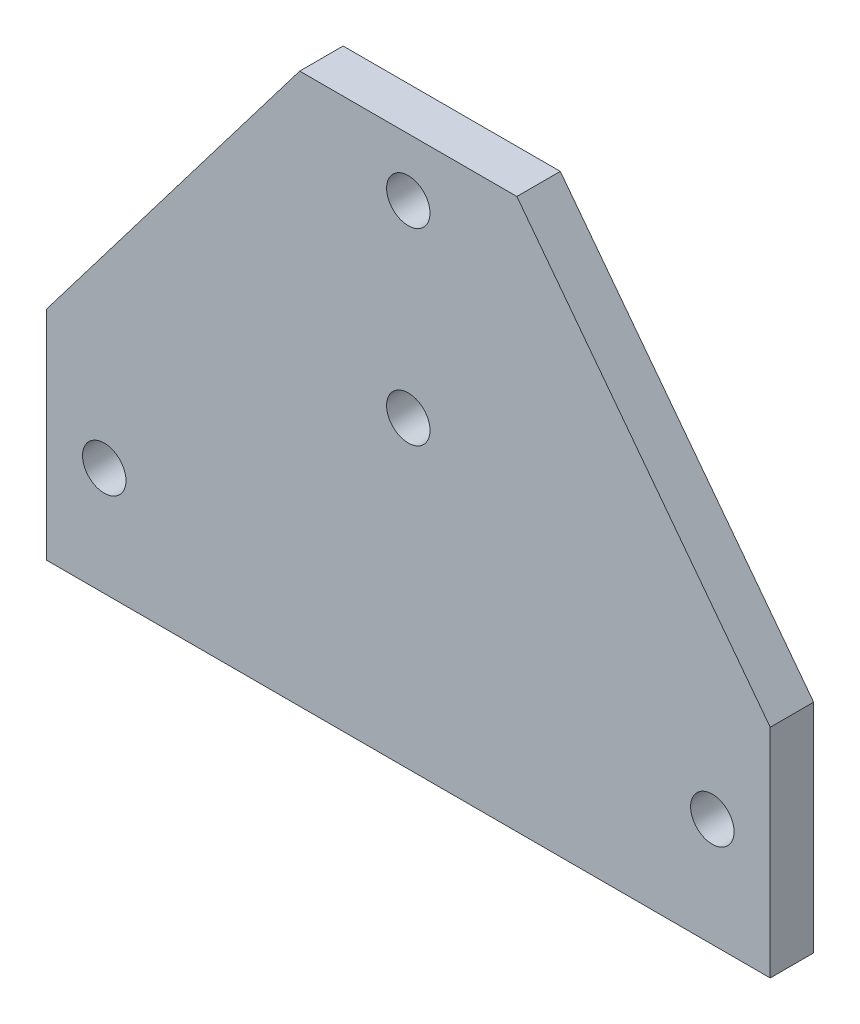
ISO-10303-21;
HEADER;
FILE_DESCRIPTION(('STEP AP214'),'2;1');
FILE_NAME('part.step','',(''),(''),'','','');
FILE_SCHEMA(('AUTOMOTIVE_DESIGN { 1 0 10303 214 1 1 1 1 }'));
ENDSEC;
DATA;
#1=APPLICATION_CONTEXT('core data for automotive mechanical design processes');
#2=APPLICATION_PROTOCOL_DEFINITION('international standard','automotive_design',2000,#1);
#3=PRODUCT_CONTEXT('',#1,'mechanical');
#4=PRODUCT('Part','Part','',(#3));
#5=PRODUCT_RELATED_PRODUCT_CATEGORY('part','',(#4));
#6=PRODUCT_DEFINITION_FORMATION('','',#4);
#7=PRODUCT_DEFINITION_CONTEXT('part definition',#1,'design');
#8=PRODUCT_DEFINITION('design','',#6,#7);
#9=PRODUCT_DEFINITION_SHAPE('','',#8);
#10=(LENGTH_UNIT() NAMED_UNIT(*) SI_UNIT(.MILLI.,.METRE.));
#11=(NAMED_UNIT(*) PLANE_ANGLE_UNIT() SI_UNIT($,.RADIAN.));
#12=(NAMED_UNIT(*) SI_UNIT($,.STERADIAN.) SOLID_ANGLE_UNIT());
#13=UNCERTAINTY_MEASURE_WITH_UNIT(LENGTH_MEASURE(1.E-05),#10,'distance_accuracy_value','');
#14=(GEOMETRIC_REPRESENTATION_CONTEXT(3) GLOBAL_UNCERTAINTY_ASSIGNED_CONTEXT((#13)) GLOBAL_UNIT_ASSIGNED_CONTEXT((#10,
#11,#12)) REPRESENTATION_CONTEXT('',''));
#15=CARTESIAN_POINT('',(0.,0.,0.));
#16=DIRECTION('',(0.,0.,1.));
#17=DIRECTION('',(1.,0.,0.));
#18=AXIS2_PLACEMENT_3D('',#15,#16,#17);
#19=CARTESIAN_POINT('',(-17.5,-23.,3.));
#20=DIRECTION('',(0.795828694120859,-0.605521832483262,0.));
#21=DIRECTION('',(0.605521832483262,0.795828694120859,0.));
#22=AXIS2_PLACEMENT_3D('',#19,#20,#21);
#23=PLANE('',#22);
#24=DIRECTION('',(-0.605521832483262,-0.795828694120859,0.));
#25=VECTOR('',#24,1.);
#26=CARTESIAN_POINT('',(-17.5,-23.,0.));
#27=LINE('',#26,#25);
#28=CARTESIAN_POINT('',(0.,0.,0.));
#29=VERTEX_POINT('',#28);
#30=CARTESIAN_POINT('',(-17.5,-23.,0.));
#31=VERTEX_POINT('',#30);
#32=EDGE_CURVE('E123',#29,#31,#27,.T.);
#33=ORIENTED_EDGE('',*,*,#32,.T.);
#34=DIRECTION('',(0.,0.,-1.));
#35=VECTOR('',#34,1.);
#36=CARTESIAN_POINT('',(-17.5,-23.,3.));
#37=LINE('',#36,#35);
#38=CARTESIAN_POINT('',(-17.5,-23.,3.));
#39=VERTEX_POINT('',#38);
#40=EDGE_CURVE('E11',#39,#31,#37,.T.);
#41=ORIENTED_EDGE('',*,*,#40,.F.);
#42=DIRECTION('',(-0.605521832483262,-0.795828694120859,0.));
#43=VECTOR('',#42,1.);
#44=CARTESIAN_POINT('',(-17.5,-23.,3.));
#45=LINE('',#44,#43);
#46=CARTESIAN_POINT('',(0.,0.,3.));
#47=VERTEX_POINT('',#46);
#48=EDGE_CURVE('E134',#47,#39,#45,.T.);
#49=ORIENTED_EDGE('',*,*,#48,.F.);
#50=DIRECTION('',(0.,0.,-1.));
#51=VECTOR('',#50,1.);
#52=CARTESIAN_POINT('',(0.,0.,3.));
#53=LINE('',#52,#51);
#54=EDGE_CURVE('E119',#47,#29,#53,.T.);
#55=ORIENTED_EDGE('',*,*,#54,.T.);
#56=EDGE_LOOP('',(#33,#41,#49,#55));
#57=FACE_BOUND('',#56,.T.);
#58=ADVANCED_FACE('F39',(#57),#23,.F.);
#59=CARTESIAN_POINT('',(-17.5,-38.,3.));
#60=DIRECTION('',(1.,0.,0.));
#61=DIRECTION('',(0.,0.,-1.));
#62=AXIS2_PLACEMENT_3D('',#59,#60,#61);
#63=PLANE('',#62);
#64=DIRECTION('',(0.,-1.,0.));
#65=VECTOR('',#64,1.);
#66=CARTESIAN_POINT('',(-17.5,-38.,0.));
#67=LINE('',#66,#65);
#68=CARTESIAN_POINT('',(-17.5,-38.,0.));
#69=VERTEX_POINT('',#68);
#70=EDGE_CURVE('E126',#31,#69,#67,.T.);
#71=ORIENTED_EDGE('',*,*,#70,.T.);
#72=DIRECTION('',(0.,0.,-1.));
#73=VECTOR('',#72,1.);
#74=CARTESIAN_POINT('',(-17.5,-38.,3.));
#75=LINE('',#74,#73);
#76=CARTESIAN_POINT('',(-17.5,-38.,3.));
#77=VERTEX_POINT('',#76);
#78=EDGE_CURVE('E47',#77,#69,#75,.T.);
#79=ORIENTED_EDGE('',*,*,#78,.F.);
#80=DIRECTION('',(0.,-1.,0.));
#81=VECTOR('',#80,1.);
#82=CARTESIAN_POINT('',(-17.5,-38.,3.));
#83=LINE('',#82,#81);
#84=EDGE_CURVE('E92',#39,#77,#83,.T.);
#85=ORIENTED_EDGE('',*,*,#84,.F.);
#86=ORIENTED_EDGE('',*,*,#40,.T.);
#87=EDGE_LOOP('',(#71,#79,#85,#86));
#88=FACE_BOUND('',#87,.T.);
#89=ADVANCED_FACE('F159',(#88),#63,.F.);
#90=CARTESIAN_POINT('',(32.5,-38.,3.));
#91=DIRECTION('',(0.,1.,0.));
#92=DIRECTION('',(0.,0.,1.));
#93=AXIS2_PLACEMENT_3D('',#90,#91,#92);
#94=PLANE('',#93);
#95=DIRECTION('',(1.,0.,0.));
#96=VECTOR('',#95,1.);
#97=CARTESIAN_POINT('',(32.5,-38.,0.));
#98=LINE('',#97,#96);
#99=CARTESIAN_POINT('',(32.5,-38.,0.));
#100=VERTEX_POINT('',#99);
#101=EDGE_CURVE('E129',#69,#100,#98,.T.);
#102=ORIENTED_EDGE('',*,*,#101,.T.);
#103=DIRECTION('',(0.,0.,-1.));
#104=VECTOR('',#103,1.);
#105=CARTESIAN_POINT('',(32.5,-38.,3.));
#106=LINE('',#105,#104);
#107=CARTESIAN_POINT('',(32.5,-38.,3.));
#108=VERTEX_POINT('',#107);
#109=EDGE_CURVE('E114',#108,#100,#106,.T.);
#110=ORIENTED_EDGE('',*,*,#109,.F.);
#111=DIRECTION('',(1.,0.,0.));
#112=VECTOR('',#111,1.);
#113=CARTESIAN_POINT('',(32.5,-38.,3.));
#114=LINE('',#113,#112);
#115=EDGE_CURVE('E105',#77,#108,#114,.T.);
#116=ORIENTED_EDGE('',*,*,#115,.F.);
#117=ORIENTED_EDGE('',*,*,#78,.T.);
#118=EDGE_LOOP('',(#102,#110,#116,#117));
#119=FACE_BOUND('',#118,.T.);
#120=ADVANCED_FACE('F140',(#119),#94,.F.);
#121=CARTESIAN_POINT('',(32.5,-23.,3.));
#122=DIRECTION('',(-1.,0.,0.));
#123=DIRECTION('',(0.,0.,1.));
#124=AXIS2_PLACEMENT_3D('',#121,#122,#123);
#125=PLANE('',#124);
#126=DIRECTION('',(0.,1.,0.));
#127=VECTOR('',#126,1.);
#128=CARTESIAN_POINT('',(32.5,-23.,0.));
#129=LINE('',#128,#127);
#130=CARTESIAN_POINT('',(32.5,-23.,0.));
#131=VERTEX_POINT('',#130);
#132=EDGE_CURVE('E113',#100,#131,#129,.T.);
#133=ORIENTED_EDGE('',*,*,#132,.T.);
#134=DIRECTION('',(0.,0.,-1.));
#135=VECTOR('',#134,1.);
#136=CARTESIAN_POINT('',(32.5,-23.,3.));
#137=LINE('',#136,#135);
#138=CARTESIAN_POINT('',(32.5,-23.,3.));
#139=VERTEX_POINT('',#138);
#140=EDGE_CURVE('E110',#139,#131,#137,.T.);
#141=ORIENTED_EDGE('',*,*,#140,.F.);
#142=DIRECTION('',(0.,1.,0.));
#143=VECTOR('',#142,1.);
#144=CARTESIAN_POINT('',(32.5,-23.,3.));
#145=LINE('',#144,#143);
#146=EDGE_CURVE('E99',#108,#139,#145,.T.);
#147=ORIENTED_EDGE('',*,*,#146,.F.);
#148=ORIENTED_EDGE('',*,*,#109,.T.);
#149=EDGE_LOOP('',(#133,#141,#147,#148));
#150=FACE_BOUND('',#149,.T.);
#151=ADVANCED_FACE('F111',(#150),#125,.F.);
#152=CARTESIAN_POINT('',(15.,0.,3.));
#153=DIRECTION('',(-0.795828694120859,-0.605521832483262,0.));
#154=DIRECTION('',(0.605521832483262,-0.795828694120859,0.));
#155=AXIS2_PLACEMENT_3D('',#152,#153,#154);
#156=PLANE('',#155);
#157=DIRECTION('',(-0.605521832483262,0.795828694120859,0.));
#158=VECTOR('',#157,1.);
#159=CARTESIAN_POINT('',(15.,0.,0.));
#160=LINE('',#159,#158);
#161=CARTESIAN_POINT('',(15.,0.,0.));
#162=VERTEX_POINT('',#161);
#163=EDGE_CURVE('E78',#131,#162,#160,.T.);
#164=ORIENTED_EDGE('',*,*,#163,.T.);
#165=DIRECTION('',(0.,0.,-1.));
#166=VECTOR('',#165,1.);
#167=CARTESIAN_POINT('',(15.,0.,3.));
#168=LINE('',#167,#166);
#169=CARTESIAN_POINT('',(15.,0.,3.));
#170=VERTEX_POINT('',#169);
#171=EDGE_CURVE('E115',#170,#162,#168,.T.);
#172=ORIENTED_EDGE('',*,*,#171,.F.);
#173=DIRECTION('',(-0.605521832483262,0.795828694120859,0.));
#174=VECTOR('',#173,1.);
#175=CARTESIAN_POINT('',(15.,0.,3.));
#176=LINE('',#175,#174);
#177=EDGE_CURVE('E103',#139,#170,#176,.T.);
#178=ORIENTED_EDGE('',*,*,#177,.F.);
#179=ORIENTED_EDGE('',*,*,#140,.T.);
#180=EDGE_LOOP('',(#164,#172,#178,#179));
#181=FACE_BOUND('',#180,.T.);
#182=ADVANCED_FACE('F117',(#181),#156,.F.);
#183=CARTESIAN_POINT('',(0.,0.,3.));
#184=DIRECTION('',(0.,-1.,0.));
#185=DIRECTION('',(0.,0.,-1.));
#186=AXIS2_PLACEMENT_3D('',#183,#184,#185);
#187=PLANE('',#186);
#188=DIRECTION('',(-1.,0.,0.));
#189=VECTOR('',#188,1.);
#190=CARTESIAN_POINT('',(0.,0.,0.));
#191=LINE('',#190,#189);
#192=EDGE_CURVE('E84',#162,#29,#191,.T.);
#193=ORIENTED_EDGE('',*,*,#192,.T.);
#194=ORIENTED_EDGE('',*,*,#54,.F.);
#195=DIRECTION('',(-1.,0.,0.));
#196=VECTOR('',#195,1.);
#197=CARTESIAN_POINT('',(0.,0.,3.));
#198=LINE('',#197,#196);
#199=EDGE_CURVE('E55',#170,#47,#198,.T.);
#200=ORIENTED_EDGE('',*,*,#199,.F.);
#201=ORIENTED_EDGE('',*,*,#171,.T.);
#202=EDGE_LOOP('',(#193,#194,#200,#201));
#203=FACE_BOUND('',#202,.T.);
#204=ADVANCED_FACE('F147',(#203),#187,.F.);
#205=CARTESIAN_POINT('',(0.,0.,3.));
#206=DIRECTION('',(0.,0.,-1.));
#207=DIRECTION('',(-1.,0.,0.));
#208=AXIS2_PLACEMENT_3D('',#205,#206,#207);
#209=PLANE('',#208);
#210=CARTESIAN_POINT('',(7.50000000000001,-4.,3.));
#211=DIRECTION('',(0.,0.,1.));
#212=DIRECTION('',(1.,0.,0.));
#213=AXIS2_PLACEMENT_3D('',#210,#211,#212);
#214=CIRCLE('',#213,1.5);
#215=CARTESIAN_POINT('',(9.00000000000001,-4.,3.));
#216=VERTEX_POINT('',#215);
#217=EDGE_CURVE('E244',#216,#216,#214,.T.);
#218=ORIENTED_EDGE('',*,*,#217,.F.);
#219=EDGE_LOOP('',(#218));
#220=FACE_BOUND('',#219,.T.);
#221=CARTESIAN_POINT('',(7.50000000000001,-17.,3.));
#222=DIRECTION('',(0.,0.,1.));
#223=DIRECTION('',(1.,0.,0.));
#224=AXIS2_PLACEMENT_3D('',#221,#222,#223);
#225=CIRCLE('',#224,1.5);
#226=CARTESIAN_POINT('',(9.00000000000001,-17.,3.));
#227=VERTEX_POINT('',#226);
#228=EDGE_CURVE('E249',#227,#227,#225,.T.);
#229=ORIENTED_EDGE('',*,*,#228,.F.);
#230=EDGE_LOOP('',(#229));
#231=FACE_BOUND('',#230,.T.);
#232=CARTESIAN_POINT('',(28.5,-30.5,3.));
#233=DIRECTION('',(0.,0.,1.));
#234=DIRECTION('',(1.,0.,0.));
#235=AXIS2_PLACEMENT_3D('',#232,#233,#234);
#236=CIRCLE('',#235,1.5);
#237=CARTESIAN_POINT('',(30.,-30.5,3.));
#238=VERTEX_POINT('',#237);
#239=EDGE_CURVE('E257',#238,#238,#236,.T.);
#240=ORIENTED_EDGE('',*,*,#239,.F.);
#241=EDGE_LOOP('',(#240));
#242=FACE_BOUND('',#241,.T.);
#243=CARTESIAN_POINT('',(-13.5,-30.5,3.));
#244=DIRECTION('',(0.,0.,1.));
#245=DIRECTION('',(1.,0.,0.));
#246=AXIS2_PLACEMENT_3D('',#243,#244,#245);
#247=CIRCLE('',#246,1.5);
#248=CARTESIAN_POINT('',(-12.,-30.5,3.));
#249=VERTEX_POINT('',#248);
#250=EDGE_CURVE('E263',#249,#249,#247,.T.);
#251=ORIENTED_EDGE('',*,*,#250,.F.);
#252=EDGE_LOOP('',(#251));
#253=FACE_BOUND('',#252,.T.);
#254=ORIENTED_EDGE('',*,*,#48,.T.);
#255=ORIENTED_EDGE('',*,*,#84,.T.);
#256=ORIENTED_EDGE('',*,*,#115,.T.);
#257=ORIENTED_EDGE('',*,*,#146,.T.);
#258=ORIENTED_EDGE('',*,*,#177,.T.);
#259=ORIENTED_EDGE('',*,*,#199,.T.);
#260=EDGE_LOOP('',(#254,#255,#256,#257,#258,#259));
#261=FACE_BOUND('',#260,.T.);
#262=ADVANCED_FACE('F101',(#220,#231,#242,#253,#261),#209,.F.);
#263=CARTESIAN_POINT('',(0.,0.,0.));
#264=DIRECTION('',(0.,0.,-1.));
#265=DIRECTION('',(-1.,0.,0.));
#266=AXIS2_PLACEMENT_3D('',#263,#264,#265);
#267=PLANE('',#266);
#268=CARTESIAN_POINT('',(7.50000000000001,-4.,0.));
#269=DIRECTION('',(0.,0.,1.));
#270=DIRECTION('',(1.,0.,0.));
#271=AXIS2_PLACEMENT_3D('',#268,#269,#270);
#272=CIRCLE('',#271,1.5);
#273=CARTESIAN_POINT('',(9.00000000000001,-4.,0.));
#274=VERTEX_POINT('',#273);
#275=EDGE_CURVE('E127',#274,#274,#272,.T.);
#276=ORIENTED_EDGE('',*,*,#275,.T.);
#277=EDGE_LOOP('',(#276));
#278=FACE_BOUND('',#277,.T.);
#279=CARTESIAN_POINT('',(7.50000000000001,-17.,0.));
#280=DIRECTION('',(0.,0.,1.));
#281=DIRECTION('',(1.,0.,0.));
#282=AXIS2_PLACEMENT_3D('',#279,#280,#281);
#283=CIRCLE('',#282,1.5);
#284=CARTESIAN_POINT('',(9.00000000000001,-17.,0.));
#285=VERTEX_POINT('',#284);
#286=EDGE_CURVE('E245',#285,#285,#283,.T.);
#287=ORIENTED_EDGE('',*,*,#286,.T.);
#288=EDGE_LOOP('',(#287));
#289=FACE_BOUND('',#288,.T.);
#290=CARTESIAN_POINT('',(28.5,-30.5,0.));
#291=DIRECTION('',(0.,0.,1.));
#292=DIRECTION('',(1.,0.,0.));
#293=AXIS2_PLACEMENT_3D('',#290,#291,#292);
#294=CIRCLE('',#293,1.5);
#295=CARTESIAN_POINT('',(30.,-30.5,0.));
#296=VERTEX_POINT('',#295);
#297=EDGE_CURVE('E254',#296,#296,#294,.T.);
#298=ORIENTED_EDGE('',*,*,#297,.T.);
#299=EDGE_LOOP('',(#298));
#300=FACE_BOUND('',#299,.T.);
#301=CARTESIAN_POINT('',(-13.5,-30.5,0.));
#302=DIRECTION('',(0.,0.,1.));
#303=DIRECTION('',(1.,0.,0.));
#304=AXIS2_PLACEMENT_3D('',#301,#302,#303);
#305=CIRCLE('',#304,1.5);
#306=CARTESIAN_POINT('',(-12.,-30.5,0.));
#307=VERTEX_POINT('',#306);
#308=EDGE_CURVE('E260',#307,#307,#305,.T.);
#309=ORIENTED_EDGE('',*,*,#308,.T.);
#310=EDGE_LOOP('',(#309));
#311=FACE_BOUND('',#310,.T.);
#312=ORIENTED_EDGE('',*,*,#32,.F.);
#313=ORIENTED_EDGE('',*,*,#192,.F.);
#314=ORIENTED_EDGE('',*,*,#163,.F.);
#315=ORIENTED_EDGE('',*,*,#132,.F.);
#316=ORIENTED_EDGE('',*,*,#101,.F.);
#317=ORIENTED_EDGE('',*,*,#70,.F.);
#318=EDGE_LOOP('',(#312,#313,#314,#315,#316,#317));
#319=FACE_BOUND('',#318,.T.);
#320=ADVANCED_FACE('F143',(#278,#289,#300,#311,#319),#267,.T.);
#321=CARTESIAN_POINT('',(-13.5,-30.5,0.));
#322=DIRECTION('',(0.,0.,1.));
#323=DIRECTION('',(1.,0.,0.));
#324=AXIS2_PLACEMENT_3D('',#321,#322,#323);
#325=CYLINDRICAL_SURFACE('',#324,1.5);
#326=ORIENTED_EDGE('',*,*,#308,.F.);
#327=EDGE_LOOP('',(#326));
#328=FACE_BOUND('',#327,.T.);
#329=ORIENTED_EDGE('',*,*,#250,.T.);
#330=EDGE_LOOP('',(#329));
#331=FACE_BOUND('',#330,.T.);
#332=ADVANCED_FACE('F196',(#328,#331),#325,.F.);
#333=CARTESIAN_POINT('',(28.5,-30.5,0.));
#334=DIRECTION('',(0.,0.,1.));
#335=DIRECTION('',(1.,0.,0.));
#336=AXIS2_PLACEMENT_3D('',#333,#334,#335);
#337=CYLINDRICAL_SURFACE('',#336,1.5);
#338=ORIENTED_EDGE('',*,*,#297,.F.);
#339=EDGE_LOOP('',(#338));
#340=FACE_BOUND('',#339,.T.);
#341=ORIENTED_EDGE('',*,*,#239,.T.);
#342=EDGE_LOOP('',(#341));
#343=FACE_BOUND('',#342,.T.);
#344=ADVANCED_FACE('F205',(#340,#343),#337,.F.);
#345=CARTESIAN_POINT('',(7.50000000000001,-17.,0.));
#346=DIRECTION('',(0.,0.,1.));
#347=DIRECTION('',(1.,0.,0.));
#348=AXIS2_PLACEMENT_3D('',#345,#346,#347);
#349=CYLINDRICAL_SURFACE('',#348,1.5);
#350=ORIENTED_EDGE('',*,*,#286,.F.);
#351=EDGE_LOOP('',(#350));
#352=FACE_BOUND('',#351,.T.);
#353=ORIENTED_EDGE('',*,*,#228,.T.);
#354=EDGE_LOOP('',(#353));
#355=FACE_BOUND('',#354,.T.);
#356=ADVANCED_FACE('F215',(#352,#355),#349,.F.);
#357=CARTESIAN_POINT('',(7.50000000000001,-4.,0.));
#358=DIRECTION('',(0.,0.,1.));
#359=DIRECTION('',(1.,0.,0.));
#360=AXIS2_PLACEMENT_3D('',#357,#358,#359);
#361=CYLINDRICAL_SURFACE('',#360,1.5);
#362=ORIENTED_EDGE('',*,*,#275,.F.);
#363=EDGE_LOOP('',(#362));
#364=FACE_BOUND('',#363,.T.);
#365=ORIENTED_EDGE('',*,*,#217,.T.);
#366=EDGE_LOOP('',(#365));
#367=FACE_BOUND('',#366,.T.);
#368=ADVANCED_FACE('F225',(#364,#367),#361,.F.);
#369=CLOSED_SHELL('',(#58,#89,#120,#151,#182,#204,#262,#320,#332,#344,#356,#368));
#370=MANIFOLD_SOLID_BREP('B2',#369);
#371=ADVANCED_BREP_SHAPE_REPRESENTATION('',(#18,#370),#14);
#372=SHAPE_DEFINITION_REPRESENTATION(#9,#371);
ENDSEC;
END-ISO-10303-21;
